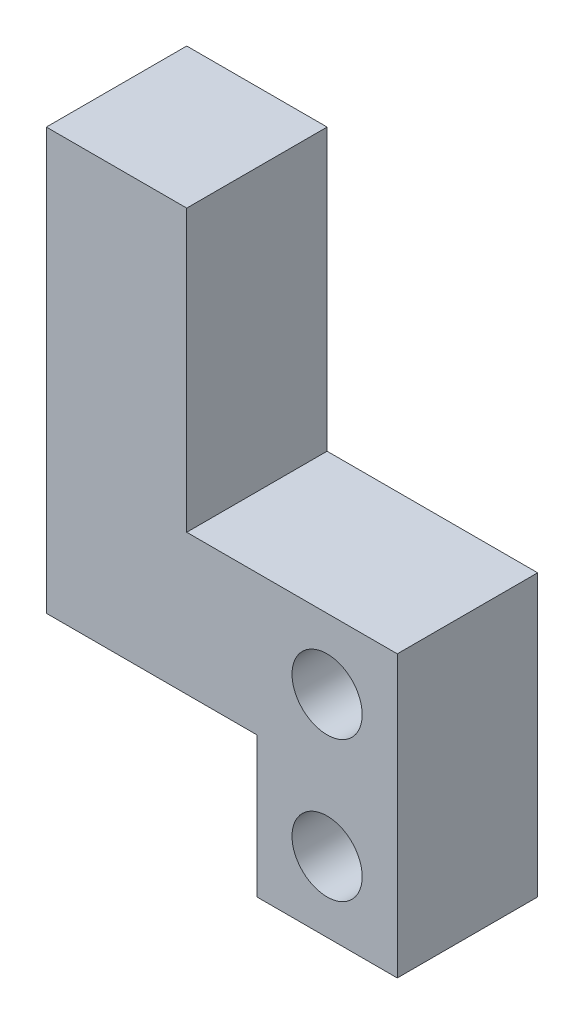
ISO-10303-21;
HEADER;
FILE_DESCRIPTION(('STEP AP214'),'2;1');
FILE_NAME('part.step','',(''),(''),'','','');
FILE_SCHEMA(('AUTOMOTIVE_DESIGN { 1 0 10303 214 1 1 1 1 }'));
ENDSEC;
DATA;
#1=APPLICATION_CONTEXT('core data for automotive mechanical design processes');
#2=APPLICATION_PROTOCOL_DEFINITION('international standard','automotive_design',2000,#1);
#3=PRODUCT_CONTEXT('',#1,'mechanical');
#4=PRODUCT('Part','Part','',(#3));
#5=PRODUCT_RELATED_PRODUCT_CATEGORY('part','',(#4));
#6=PRODUCT_DEFINITION_FORMATION('','',#4);
#7=PRODUCT_DEFINITION_CONTEXT('part definition',#1,'design');
#8=PRODUCT_DEFINITION('design','',#6,#7);
#9=PRODUCT_DEFINITION_SHAPE('','',#8);
#10=(LENGTH_UNIT() NAMED_UNIT(*) SI_UNIT(.MILLI.,.METRE.));
#11=(NAMED_UNIT(*) PLANE_ANGLE_UNIT() SI_UNIT($,.RADIAN.));
#12=(NAMED_UNIT(*) SI_UNIT($,.STERADIAN.) SOLID_ANGLE_UNIT());
#13=UNCERTAINTY_MEASURE_WITH_UNIT(LENGTH_MEASURE(1.E-05),#10,'distance_accuracy_value','');
#14=(GEOMETRIC_REPRESENTATION_CONTEXT(3) GLOBAL_UNCERTAINTY_ASSIGNED_CONTEXT((#13)) GLOBAL_UNIT_ASSIGNED_CONTEXT((#10,
#11,#12)) REPRESENTATION_CONTEXT('',''));
#15=CARTESIAN_POINT('',(0.,0.,0.));
#16=DIRECTION('',(0.,0.,1.));
#17=DIRECTION('',(1.,0.,0.));
#18=AXIS2_PLACEMENT_3D('',#15,#16,#17);
#19=CARTESIAN_POINT('',(0.,0.,10.));
#20=DIRECTION('',(0.,0.,-1.));
#21=DIRECTION('',(-1.,0.,0.));
#22=AXIS2_PLACEMENT_3D('',#19,#20,#21);
#23=PLANE('',#22);
#24=DIRECTION('',(0.,1.,0.));
#25=VECTOR('',#24,1.);
#26=CARTESIAN_POINT('',(12.5,-5.,10.));
#27=LINE('',#26,#25);
#28=CARTESIAN_POINT('',(12.5,-15.,10.));
#29=VERTEX_POINT('',#28);
#30=CARTESIAN_POINT('',(12.5,5.,10.));
#31=VERTEX_POINT('',#30);
#32=EDGE_CURVE('E49',#29,#31,#27,.T.);
#33=ORIENTED_EDGE('',*,*,#32,.T.);
#34=DIRECTION('',(-1.,0.,0.));
#35=VECTOR('',#34,1.);
#36=CARTESIAN_POINT('',(-2.5,5.,10.));
#37=LINE('',#36,#35);
#38=CARTESIAN_POINT('',(-2.5,5.,10.));
#39=VERTEX_POINT('',#38);
#40=EDGE_CURVE('E93',#31,#39,#37,.T.);
#41=ORIENTED_EDGE('',*,*,#40,.T.);
#42=DIRECTION('',(0.,1.,0.));
#43=VECTOR('',#42,1.);
#44=CARTESIAN_POINT('',(-2.5,5.,10.));
#45=LINE('',#44,#43);
#46=CARTESIAN_POINT('',(-2.5,25.,10.));
#47=VERTEX_POINT('',#46);
#48=EDGE_CURVE('E162',#39,#47,#45,.T.);
#49=ORIENTED_EDGE('',*,*,#48,.T.);
#50=DIRECTION('',(-1.,0.,0.));
#51=VECTOR('',#50,1.);
#52=CARTESIAN_POINT('',(-12.5,25.,10.));
#53=LINE('',#52,#51);
#54=CARTESIAN_POINT('',(-12.5,25.,10.));
#55=VERTEX_POINT('',#54);
#56=EDGE_CURVE('E175',#47,#55,#53,.T.);
#57=ORIENTED_EDGE('',*,*,#56,.T.);
#58=DIRECTION('',(0.,-1.,0.));
#59=VECTOR('',#58,1.);
#60=CARTESIAN_POINT('',(-12.5,5.,10.));
#61=LINE('',#60,#59);
#62=CARTESIAN_POINT('',(-12.5,-5.,10.));
#63=VERTEX_POINT('',#62);
#64=EDGE_CURVE('E113',#55,#63,#61,.T.);
#65=ORIENTED_EDGE('',*,*,#64,.T.);
#66=DIRECTION('',(1.,0.,0.));
#67=VECTOR('',#66,1.);
#68=CARTESIAN_POINT('',(-12.5,-5.,10.));
#69=LINE('',#68,#67);
#70=CARTESIAN_POINT('',(2.5,-5.,10.));
#71=VERTEX_POINT('',#70);
#72=EDGE_CURVE('E107',#63,#71,#69,.T.);
#73=ORIENTED_EDGE('',*,*,#72,.T.);
#74=DIRECTION('',(0.,-1.,0.));
#75=VECTOR('',#74,1.);
#76=CARTESIAN_POINT('',(2.5,-5.,10.));
#77=LINE('',#76,#75);
#78=CARTESIAN_POINT('',(2.5,-15.,10.));
#79=VERTEX_POINT('',#78);
#80=EDGE_CURVE('E111',#71,#79,#77,.T.);
#81=ORIENTED_EDGE('',*,*,#80,.T.);
#82=DIRECTION('',(1.,0.,0.));
#83=VECTOR('',#82,1.);
#84=CARTESIAN_POINT('',(12.5,-15.,10.));
#85=LINE('',#84,#83);
#86=EDGE_CURVE('E127',#79,#29,#85,.T.);
#87=ORIENTED_EDGE('',*,*,#86,.T.);
#88=EDGE_LOOP('',(#33,#41,#49,#57,#65,#73,#81,#87));
#89=FACE_BOUND('',#88,.T.);
#90=CARTESIAN_POINT('',(7.5,-10.,10.));
#91=DIRECTION('',(0.,0.,1.));
#92=DIRECTION('',(1.,0.,0.));
#93=AXIS2_PLACEMENT_3D('',#90,#91,#92);
#94=CIRCLE('',#93,2.5);
#95=CARTESIAN_POINT('',(10.,-10.,10.));
#96=VERTEX_POINT('',#95);
#97=EDGE_CURVE('E136',#96,#96,#94,.T.);
#98=ORIENTED_EDGE('',*,*,#97,.F.);
#99=EDGE_LOOP('',(#98));
#100=FACE_BOUND('',#99,.T.);
#101=CARTESIAN_POINT('',(7.5,0.,10.));
#102=DIRECTION('',(0.,0.,1.));
#103=DIRECTION('',(1.,0.,0.));
#104=AXIS2_PLACEMENT_3D('',#101,#102,#103);
#105=CIRCLE('',#104,2.5);
#106=CARTESIAN_POINT('',(10.,0.,10.));
#107=VERTEX_POINT('',#106);
#108=EDGE_CURVE('E184',#107,#107,#105,.T.);
#109=ORIENTED_EDGE('',*,*,#108,.F.);
#110=EDGE_LOOP('',(#109));
#111=FACE_BOUND('',#110,.T.);
#112=ADVANCED_FACE('F32',(#89,#100,#111),#23,.F.);
#113=CARTESIAN_POINT('',(0.,0.,0.));
#114=DIRECTION('',(0.,0.,-1.));
#115=DIRECTION('',(-1.,0.,0.));
#116=AXIS2_PLACEMENT_3D('',#113,#114,#115);
#117=PLANE('',#116);
#118=CARTESIAN_POINT('',(7.5,-10.,0.));
#119=DIRECTION('',(0.,0.,1.));
#120=DIRECTION('',(1.,0.,0.));
#121=AXIS2_PLACEMENT_3D('',#118,#119,#120);
#122=CIRCLE('',#121,2.5);
#123=CARTESIAN_POINT('',(10.,-10.,0.));
#124=VERTEX_POINT('',#123);
#125=EDGE_CURVE('E181',#124,#124,#122,.T.);
#126=ORIENTED_EDGE('',*,*,#125,.T.);
#127=EDGE_LOOP('',(#126));
#128=FACE_BOUND('',#127,.T.);
#129=DIRECTION('',(-1.,0.,0.));
#130=VECTOR('',#129,1.);
#131=CARTESIAN_POINT('',(-2.5,5.,0.));
#132=LINE('',#131,#130);
#133=CARTESIAN_POINT('',(12.5,5.,0.));
#134=VERTEX_POINT('',#133);
#135=CARTESIAN_POINT('',(-2.5,5.,0.));
#136=VERTEX_POINT('',#135);
#137=EDGE_CURVE('E133',#134,#136,#132,.T.);
#138=ORIENTED_EDGE('',*,*,#137,.F.);
#139=DIRECTION('',(0.,1.,0.));
#140=VECTOR('',#139,1.);
#141=CARTESIAN_POINT('',(12.5,-5.,0.));
#142=LINE('',#141,#140);
#143=CARTESIAN_POINT('',(12.5,-15.,0.));
#144=VERTEX_POINT('',#143);
#145=EDGE_CURVE('E146',#144,#134,#142,.T.);
#146=ORIENTED_EDGE('',*,*,#145,.F.);
#147=DIRECTION('',(1.,0.,0.));
#148=VECTOR('',#147,1.);
#149=CARTESIAN_POINT('',(12.5,-15.,0.));
#150=LINE('',#149,#148);
#151=CARTESIAN_POINT('',(2.5,-15.,0.));
#152=VERTEX_POINT('',#151);
#153=EDGE_CURVE('E86',#152,#144,#150,.T.);
#154=ORIENTED_EDGE('',*,*,#153,.F.);
#155=DIRECTION('',(0.,-1.,0.));
#156=VECTOR('',#155,1.);
#157=CARTESIAN_POINT('',(2.5,-5.,0.));
#158=LINE('',#157,#156);
#159=CARTESIAN_POINT('',(2.5,-5.,0.));
#160=VERTEX_POINT('',#159);
#161=EDGE_CURVE('E79',#160,#152,#158,.T.);
#162=ORIENTED_EDGE('',*,*,#161,.F.);
#163=DIRECTION('',(1.,0.,0.));
#164=VECTOR('',#163,1.);
#165=CARTESIAN_POINT('',(-12.5,-5.,0.));
#166=LINE('',#165,#164);
#167=CARTESIAN_POINT('',(-12.5,-5.,0.));
#168=VERTEX_POINT('',#167);
#169=EDGE_CURVE('E121',#168,#160,#166,.T.);
#170=ORIENTED_EDGE('',*,*,#169,.F.);
#171=DIRECTION('',(0.,-1.,0.));
#172=VECTOR('',#171,1.);
#173=CARTESIAN_POINT('',(-12.5,-5.,0.));
#174=LINE('',#173,#172);
#175=CARTESIAN_POINT('',(-12.5,25.,0.));
#176=VERTEX_POINT('',#175);
#177=EDGE_CURVE('E141',#176,#168,#174,.T.);
#178=ORIENTED_EDGE('',*,*,#177,.F.);
#179=DIRECTION('',(-1.,0.,0.));
#180=VECTOR('',#179,1.);
#181=CARTESIAN_POINT('',(-12.5,25.,0.));
#182=LINE('',#181,#180);
#183=CARTESIAN_POINT('',(-2.5,25.,0.));
#184=VERTEX_POINT('',#183);
#185=EDGE_CURVE('E138',#184,#176,#182,.T.);
#186=ORIENTED_EDGE('',*,*,#185,.F.);
#187=DIRECTION('',(0.,1.,0.));
#188=VECTOR('',#187,1.);
#189=CARTESIAN_POINT('',(-2.5,5.,0.));
#190=LINE('',#189,#188);
#191=EDGE_CURVE('E135',#136,#184,#190,.T.);
#192=ORIENTED_EDGE('',*,*,#191,.F.);
#193=EDGE_LOOP('',(#138,#146,#154,#162,#170,#178,#186,#192));
#194=FACE_BOUND('',#193,.T.);
#195=CARTESIAN_POINT('',(7.5,0.,0.));
#196=DIRECTION('',(0.,0.,1.));
#197=DIRECTION('',(1.,0.,0.));
#198=AXIS2_PLACEMENT_3D('',#195,#196,#197);
#199=CIRCLE('',#198,2.5);
#200=CARTESIAN_POINT('',(10.,0.,0.));
#201=VERTEX_POINT('',#200);
#202=EDGE_CURVE('E187',#201,#201,#199,.T.);
#203=ORIENTED_EDGE('',*,*,#202,.T.);
#204=EDGE_LOOP('',(#203));
#205=FACE_BOUND('',#204,.T.);
#206=ADVANCED_FACE('F166',(#128,#194,#205),#117,.T.);
#207=CARTESIAN_POINT('',(-2.5,5.,10.));
#208=DIRECTION('',(0.,-1.,0.));
#209=DIRECTION('',(0.,0.,-1.));
#210=AXIS2_PLACEMENT_3D('',#207,#208,#209);
#211=PLANE('',#210);
#212=ORIENTED_EDGE('',*,*,#137,.T.);
#213=DIRECTION('',(0.,0.,-1.));
#214=VECTOR('',#213,1.);
#215=CARTESIAN_POINT('',(-2.5,5.,10.));
#216=LINE('',#215,#214);
#217=EDGE_CURVE('E41',#39,#136,#216,.T.);
#218=ORIENTED_EDGE('',*,*,#217,.F.);
#219=ORIENTED_EDGE('',*,*,#40,.F.);
#220=DIRECTION('',(0.,0.,-1.));
#221=VECTOR('',#220,1.);
#222=CARTESIAN_POINT('',(12.5,5.,10.));
#223=LINE('',#222,#221);
#224=EDGE_CURVE('E11',#31,#134,#223,.T.);
#225=ORIENTED_EDGE('',*,*,#224,.T.);
#226=EDGE_LOOP('',(#212,#218,#219,#225));
#227=FACE_BOUND('',#226,.T.);
#228=ADVANCED_FACE('F34',(#227),#211,.F.);
#229=CARTESIAN_POINT('',(-2.5,5.,10.));
#230=DIRECTION('',(-1.,0.,0.));
#231=DIRECTION('',(0.,0.,1.));
#232=AXIS2_PLACEMENT_3D('',#229,#230,#231);
#233=PLANE('',#232);
#234=ORIENTED_EDGE('',*,*,#191,.T.);
#235=DIRECTION('',(0.,0.,-1.));
#236=VECTOR('',#235,1.);
#237=CARTESIAN_POINT('',(-2.5,25.,10.));
#238=LINE('',#237,#236);
#239=EDGE_CURVE('E154',#47,#184,#238,.T.);
#240=ORIENTED_EDGE('',*,*,#239,.F.);
#241=ORIENTED_EDGE('',*,*,#48,.F.);
#242=ORIENTED_EDGE('',*,*,#217,.T.);
#243=EDGE_LOOP('',(#234,#240,#241,#242));
#244=FACE_BOUND('',#243,.T.);
#245=ADVANCED_FACE('F160',(#244),#233,.F.);
#246=CARTESIAN_POINT('',(-12.5,25.,10.));
#247=DIRECTION('',(0.,-1.,0.));
#248=DIRECTION('',(0.,0.,-1.));
#249=AXIS2_PLACEMENT_3D('',#246,#247,#248);
#250=PLANE('',#249);
#251=ORIENTED_EDGE('',*,*,#185,.T.);
#252=DIRECTION('',(0.,0.,-1.));
#253=VECTOR('',#252,1.);
#254=CARTESIAN_POINT('',(-12.5,25.,10.));
#255=LINE('',#254,#253);
#256=EDGE_CURVE('E151',#55,#176,#255,.T.);
#257=ORIENTED_EDGE('',*,*,#256,.F.);
#258=ORIENTED_EDGE('',*,*,#56,.F.);
#259=ORIENTED_EDGE('',*,*,#239,.T.);
#260=EDGE_LOOP('',(#251,#257,#258,#259));
#261=FACE_BOUND('',#260,.T.);
#262=ADVANCED_FACE('F171',(#261),#250,.F.);
#263=CARTESIAN_POINT('',(-12.5,-5.,10.));
#264=DIRECTION('',(1.,0.,0.));
#265=DIRECTION('',(0.,0.,-1.));
#266=AXIS2_PLACEMENT_3D('',#263,#264,#265);
#267=PLANE('',#266);
#268=ORIENTED_EDGE('',*,*,#177,.T.);
#269=DIRECTION('',(0.,0.,-1.));
#270=VECTOR('',#269,1.);
#271=CARTESIAN_POINT('',(-12.5,-5.,10.));
#272=LINE('',#271,#270);
#273=EDGE_CURVE('E122',#63,#168,#272,.T.);
#274=ORIENTED_EDGE('',*,*,#273,.F.);
#275=ORIENTED_EDGE('',*,*,#64,.F.);
#276=ORIENTED_EDGE('',*,*,#256,.T.);
#277=EDGE_LOOP('',(#268,#274,#275,#276));
#278=FACE_BOUND('',#277,.T.);
#279=ADVANCED_FACE('F174',(#278),#267,.F.);
#280=CARTESIAN_POINT('',(-12.5,-5.,10.));
#281=DIRECTION('',(0.,1.,0.));
#282=DIRECTION('',(-1.,0.,0.));
#283=AXIS2_PLACEMENT_3D('',#280,#281,#282);
#284=PLANE('',#283);
#285=ORIENTED_EDGE('',*,*,#169,.T.);
#286=DIRECTION('',(0.,0.,-1.));
#287=VECTOR('',#286,1.);
#288=CARTESIAN_POINT('',(2.5,-5.,10.));
#289=LINE('',#288,#287);
#290=EDGE_CURVE('E118',#71,#160,#289,.T.);
#291=ORIENTED_EDGE('',*,*,#290,.F.);
#292=ORIENTED_EDGE('',*,*,#72,.F.);
#293=ORIENTED_EDGE('',*,*,#273,.T.);
#294=EDGE_LOOP('',(#285,#291,#292,#293));
#295=FACE_BOUND('',#294,.T.);
#296=ADVANCED_FACE('F119',(#295),#284,.F.);
#297=CARTESIAN_POINT('',(2.5,-5.,10.));
#298=DIRECTION('',(1.,0.,0.));
#299=DIRECTION('',(0.,0.,-1.));
#300=AXIS2_PLACEMENT_3D('',#297,#298,#299);
#301=PLANE('',#300);
#302=ORIENTED_EDGE('',*,*,#161,.T.);
#303=DIRECTION('',(0.,0.,-1.));
#304=VECTOR('',#303,1.);
#305=CARTESIAN_POINT('',(2.5,-15.,10.));
#306=LINE('',#305,#304);
#307=EDGE_CURVE('E123',#79,#152,#306,.T.);
#308=ORIENTED_EDGE('',*,*,#307,.F.);
#309=ORIENTED_EDGE('',*,*,#80,.F.);
#310=ORIENTED_EDGE('',*,*,#290,.T.);
#311=EDGE_LOOP('',(#302,#308,#309,#310));
#312=FACE_BOUND('',#311,.T.);
#313=ADVANCED_FACE('F125',(#312),#301,.F.);
#314=CARTESIAN_POINT('',(12.5,-15.,10.));
#315=DIRECTION('',(0.,1.,0.));
#316=DIRECTION('',(-1.,0.,0.));
#317=AXIS2_PLACEMENT_3D('',#314,#315,#316);
#318=PLANE('',#317);
#319=ORIENTED_EDGE('',*,*,#153,.T.);
#320=DIRECTION('',(0.,0.,-1.));
#321=VECTOR('',#320,1.);
#322=CARTESIAN_POINT('',(12.5,-15.,10.));
#323=LINE('',#322,#321);
#324=EDGE_CURVE('E129',#29,#144,#323,.T.);
#325=ORIENTED_EDGE('',*,*,#324,.F.);
#326=ORIENTED_EDGE('',*,*,#86,.F.);
#327=ORIENTED_EDGE('',*,*,#307,.T.);
#328=EDGE_LOOP('',(#319,#325,#326,#327));
#329=FACE_BOUND('',#328,.T.);
#330=ADVANCED_FACE('F210',(#329),#318,.F.);
#331=CARTESIAN_POINT('',(12.5,-5.,10.));
#332=DIRECTION('',(-1.,0.,0.));
#333=DIRECTION('',(0.,-1.,0.));
#334=AXIS2_PLACEMENT_3D('',#331,#332,#333);
#335=PLANE('',#334);
#336=ORIENTED_EDGE('',*,*,#145,.T.);
#337=ORIENTED_EDGE('',*,*,#224,.F.);
#338=ORIENTED_EDGE('',*,*,#32,.F.);
#339=ORIENTED_EDGE('',*,*,#324,.T.);
#340=EDGE_LOOP('',(#336,#337,#338,#339));
#341=FACE_BOUND('',#340,.T.);
#342=ADVANCED_FACE('F207',(#341),#335,.F.);
#343=CARTESIAN_POINT('',(7.5,-10.,10.));
#344=DIRECTION('',(0.,0.,-1.));
#345=DIRECTION('',(-1.,0.,0.));
#346=AXIS2_PLACEMENT_3D('',#343,#344,#345);
#347=CYLINDRICAL_SURFACE('',#346,2.5);
#348=ORIENTED_EDGE('',*,*,#97,.T.);
#349=EDGE_LOOP('',(#348));
#350=FACE_BOUND('',#349,.T.);
#351=ORIENTED_EDGE('',*,*,#125,.F.);
#352=EDGE_LOOP('',(#351));
#353=FACE_BOUND('',#352,.T.);
#354=ADVANCED_FACE('F204',(#350,#353),#347,.F.);
#355=CARTESIAN_POINT('',(7.5,0.,10.));
#356=DIRECTION('',(0.,0.,-1.));
#357=DIRECTION('',(-1.,0.,0.));
#358=AXIS2_PLACEMENT_3D('',#355,#356,#357);
#359=CYLINDRICAL_SURFACE('',#358,2.5);
#360=ORIENTED_EDGE('',*,*,#108,.T.);
#361=EDGE_LOOP('',(#360));
#362=FACE_BOUND('',#361,.T.);
#363=ORIENTED_EDGE('',*,*,#202,.F.);
#364=EDGE_LOOP('',(#363));
#365=FACE_BOUND('',#364,.T.);
#366=ADVANCED_FACE('F193',(#362,#365),#359,.F.);
#367=CLOSED_SHELL('',(#112,#206,#228,#245,#262,#279,#296,#313,#330,#342,#354,#366));
#368=MANIFOLD_SOLID_BREP('B2',#367);
#369=ADVANCED_BREP_SHAPE_REPRESENTATION('',(#18,#368),#14);
#370=SHAPE_DEFINITION_REPRESENTATION(#9,#369);
ENDSEC;
END-ISO-10303-21;
